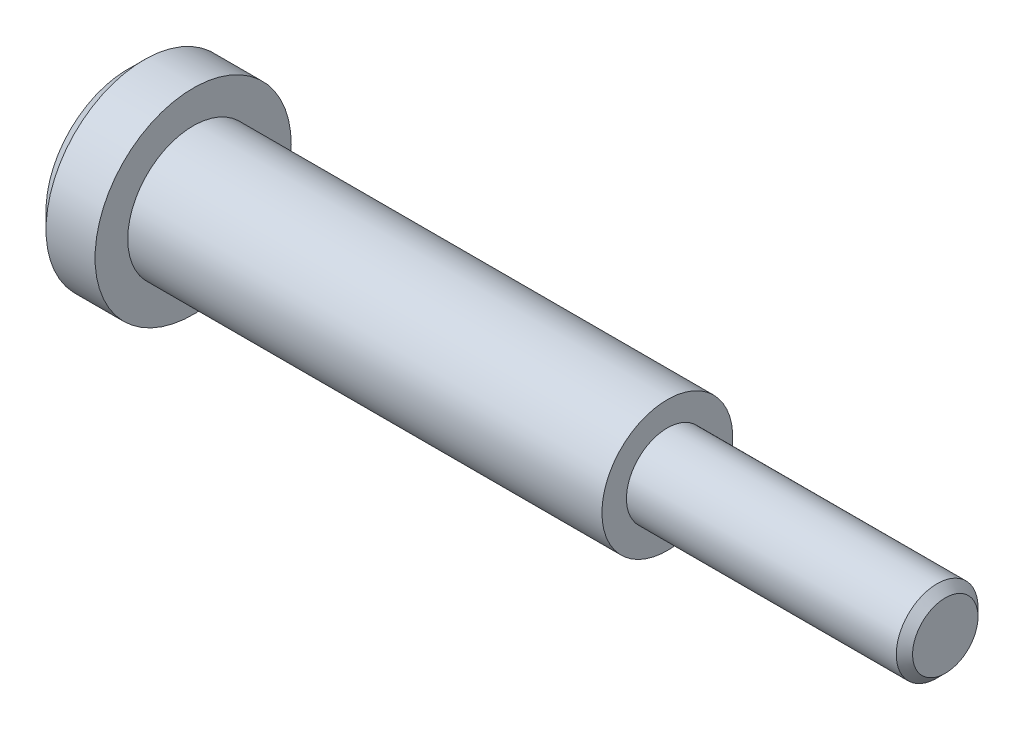
ISO-10303-21;
HEADER;
FILE_DESCRIPTION(('STEP AP214'),'2;1');
FILE_NAME('part.step','',(''),(''),'','','');
FILE_SCHEMA(('AUTOMOTIVE_DESIGN { 1 0 10303 214 1 1 1 1 }'));
ENDSEC;
DATA;
#1=APPLICATION_CONTEXT('core data for automotive mechanical design processes');
#2=APPLICATION_PROTOCOL_DEFINITION('international standard','automotive_design',2000,#1);
#3=PRODUCT_CONTEXT('',#1,'mechanical');
#4=PRODUCT('Part','Part','',(#3));
#5=PRODUCT_RELATED_PRODUCT_CATEGORY('part','',(#4));
#6=PRODUCT_DEFINITION_FORMATION('','',#4);
#7=PRODUCT_DEFINITION_CONTEXT('part definition',#1,'design');
#8=PRODUCT_DEFINITION('design','',#6,#7);
#9=PRODUCT_DEFINITION_SHAPE('','',#8);
#10=(LENGTH_UNIT() NAMED_UNIT(*) SI_UNIT(.MILLI.,.METRE.));
#11=(NAMED_UNIT(*) PLANE_ANGLE_UNIT() SI_UNIT($,.RADIAN.));
#12=(NAMED_UNIT(*) SI_UNIT($,.STERADIAN.) SOLID_ANGLE_UNIT());
#13=UNCERTAINTY_MEASURE_WITH_UNIT(LENGTH_MEASURE(1.E-05),#10,'distance_accuracy_value','');
#14=(GEOMETRIC_REPRESENTATION_CONTEXT(3) GLOBAL_UNCERTAINTY_ASSIGNED_CONTEXT((#13)) GLOBAL_UNIT_ASSIGNED_CONTEXT((#10,
#11,#12)) REPRESENTATION_CONTEXT('',''));
#15=CARTESIAN_POINT('',(0.,0.,0.));
#16=DIRECTION('',(0.,0.,1.));
#17=DIRECTION('',(1.,0.,0.));
#18=AXIS2_PLACEMENT_3D('',#15,#16,#17);
#19=CARTESIAN_POINT('',(4.,0.,0.));
#20=DIRECTION('',(-1.,0.,0.));
#21=DIRECTION('',(0.,0.,1.));
#22=AXIS2_PLACEMENT_3D('',#19,#20,#21);
#23=CYLINDRICAL_SURFACE('',#22,6.);
#24=CARTESIAN_POINT('',(1.00000000000002,0.,0.));
#25=DIRECTION('',(1.,0.,0.));
#26=DIRECTION('',(0.,0.,-1.));
#27=AXIS2_PLACEMENT_3D('',#24,#25,#26);
#28=CIRCLE('',#27,6.);
#29=CARTESIAN_POINT('',(1.00000000000002,0.,-6.));
#30=VERTEX_POINT('',#29);
#31=EDGE_CURVE('E45',#30,#30,#28,.T.);
#32=ORIENTED_EDGE('',*,*,#31,.T.);
#33=EDGE_LOOP('',(#32));
#34=FACE_BOUND('',#33,.T.);
#35=CARTESIAN_POINT('',(4.,0.,0.));
#36=DIRECTION('',(1.,0.,0.));
#37=DIRECTION('',(0.,0.,-1.));
#38=AXIS2_PLACEMENT_3D('',#35,#36,#37);
#39=CIRCLE('',#38,6.);
#40=CARTESIAN_POINT('',(4.,0.,-6.));
#41=VERTEX_POINT('',#40);
#42=EDGE_CURVE('E57',#41,#41,#39,.T.);
#43=ORIENTED_EDGE('',*,*,#42,.F.);
#44=EDGE_LOOP('',(#43));
#45=FACE_BOUND('',#44,.T.);
#46=ADVANCED_FACE('F30',(#34,#45),#23,.T.);
#47=CARTESIAN_POINT('',(4.,0.,0.));
#48=DIRECTION('',(1.,0.,0.));
#49=DIRECTION('',(0.,0.,-1.));
#50=AXIS2_PLACEMENT_3D('',#47,#48,#49);
#51=PLANE('',#50);
#52=CARTESIAN_POINT('',(4.,0.,0.));
#53=DIRECTION('',(1.,0.,0.));
#54=DIRECTION('',(0.,0.,-1.));
#55=AXIS2_PLACEMENT_3D('',#52,#53,#54);
#56=CIRCLE('',#55,4.);
#57=CARTESIAN_POINT('',(4.,0.,4.));
#58=VERTEX_POINT('',#57);
#59=EDGE_CURVE('E60',#58,#58,#56,.T.);
#60=ORIENTED_EDGE('',*,*,#59,.F.);
#61=EDGE_LOOP('',(#60));
#62=FACE_BOUND('',#61,.T.);
#63=ORIENTED_EDGE('',*,*,#42,.T.);
#64=EDGE_LOOP('',(#63));
#65=FACE_BOUND('',#64,.T.);
#66=ADVANCED_FACE('F87',(#62,#65),#51,.T.);
#67=CARTESIAN_POINT('',(0.,0.,0.));
#68=DIRECTION('',(1.,0.,0.));
#69=DIRECTION('',(0.,0.,-1.));
#70=AXIS2_PLACEMENT_3D('',#67,#68,#69);
#71=PLANE('',#70);
#72=CARTESIAN_POINT('',(0.,0.,0.));
#73=DIRECTION('',(1.,0.,0.));
#74=DIRECTION('',(0.,0.,-1.));
#75=AXIS2_PLACEMENT_3D('',#72,#73,#74);
#76=CIRCLE('',#75,3.);
#77=CARTESIAN_POINT('',(0.,0.,-3.));
#78=VERTEX_POINT('',#77);
#79=EDGE_CURVE('E10',#78,#78,#76,.T.);
#80=ORIENTED_EDGE('',*,*,#79,.T.);
#81=EDGE_LOOP('',(#80));
#82=FACE_BOUND('',#81,.T.);
#83=CARTESIAN_POINT('',(0.,0.,0.));
#84=DIRECTION('',(1.,0.,0.));
#85=DIRECTION('',(0.,0.,-1.));
#86=AXIS2_PLACEMENT_3D('',#83,#84,#85);
#87=CIRCLE('',#86,4.99999999999998);
#88=CARTESIAN_POINT('',(0.,0.,-4.99999999999998));
#89=VERTEX_POINT('',#88);
#90=EDGE_CURVE('E41',#89,#89,#87,.F.);
#91=ORIENTED_EDGE('',*,*,#90,.T.);
#92=EDGE_LOOP('',(#91));
#93=FACE_BOUND('',#92,.T.);
#94=ADVANCED_FACE('F93',(#82,#93),#71,.F.);
#95=CARTESIAN_POINT('',(33.,0.,0.));
#96=DIRECTION('',(-1.,0.,0.));
#97=DIRECTION('',(0.,0.,1.));
#98=AXIS2_PLACEMENT_3D('',#95,#96,#97);
#99=CYLINDRICAL_SURFACE('',#98,4.);
#100=CARTESIAN_POINT('',(33.,0.,0.));
#101=DIRECTION('',(1.,0.,0.));
#102=DIRECTION('',(0.,0.,-1.));
#103=AXIS2_PLACEMENT_3D('',#100,#101,#102);
#104=CIRCLE('',#103,4.);
#105=CARTESIAN_POINT('',(33.,0.,4.));
#106=VERTEX_POINT('',#105);
#107=EDGE_CURVE('E61',#106,#106,#104,.T.);
#108=CARTESIAN_POINT('',(33.,0.,4.));
#109=CARTESIAN_POINT('',(32.6979166666667,0.,4.));
#110=CARTESIAN_POINT('',(32.3958333333333,0.,4.));
#111=CARTESIAN_POINT('',(31.7916666666667,0.,4.));
#112=CARTESIAN_POINT('',(31.4895833333333,0.,4.));
#113=CARTESIAN_POINT('',(30.8854166666667,0.,4.));
#114=CARTESIAN_POINT('',(30.5833333333333,0.,4.));
#115=CARTESIAN_POINT('',(29.9791666666667,0.,4.));
#116=CARTESIAN_POINT('',(29.6770833333333,0.,4.));
#117=CARTESIAN_POINT('',(29.0729166666667,0.,4.));
#118=CARTESIAN_POINT('',(28.7708333333333,0.,4.));
#119=CARTESIAN_POINT('',(28.1666666666667,0.,4.));
#120=CARTESIAN_POINT('',(27.8645833333333,0.,4.));
#121=CARTESIAN_POINT('',(27.2604166666667,0.,4.));
#122=CARTESIAN_POINT('',(26.9583333333333,0.,4.));
#123=CARTESIAN_POINT('',(26.3541666666667,0.,4.));
#124=CARTESIAN_POINT('',(26.0520833333333,0.,4.));
#125=CARTESIAN_POINT('',(25.4479166666667,0.,4.));
#126=CARTESIAN_POINT('',(25.1458333333333,0.,4.));
#127=CARTESIAN_POINT('',(24.5416666666667,0.,4.));
#128=CARTESIAN_POINT('',(24.2395833333333,0.,4.));
#129=CARTESIAN_POINT('',(23.6354166666667,0.,4.));
#130=CARTESIAN_POINT('',(23.3333333333333,0.,4.));
#131=CARTESIAN_POINT('',(22.7291666666667,0.,4.));
#132=CARTESIAN_POINT('',(22.4270833333333,0.,4.));
#133=CARTESIAN_POINT('',(21.8229166666667,0.,4.));
#134=CARTESIAN_POINT('',(21.5208333333333,0.,4.));
#135=CARTESIAN_POINT('',(20.9166666666667,0.,4.));
#136=CARTESIAN_POINT('',(20.6145833333333,0.,4.));
#137=CARTESIAN_POINT('',(20.0104166666667,0.,4.));
#138=CARTESIAN_POINT('',(19.7083333333333,0.,4.));
#139=CARTESIAN_POINT('',(19.1041666666667,0.,4.));
#140=CARTESIAN_POINT('',(18.8020833333333,0.,4.));
#141=CARTESIAN_POINT('',(18.1979166666667,0.,4.));
#142=CARTESIAN_POINT('',(17.8958333333333,0.,4.));
#143=CARTESIAN_POINT('',(17.2916666666667,0.,4.));
#144=CARTESIAN_POINT('',(16.9895833333333,0.,4.));
#145=CARTESIAN_POINT('',(16.3854166666667,0.,4.));
#146=CARTESIAN_POINT('',(16.0833333333333,0.,4.));
#147=CARTESIAN_POINT('',(15.4791666666667,0.,4.));
#148=CARTESIAN_POINT('',(15.1770833333333,0.,4.));
#149=CARTESIAN_POINT('',(14.5729166666667,0.,4.));
#150=CARTESIAN_POINT('',(14.2708333333333,0.,4.));
#151=CARTESIAN_POINT('',(13.6666666666667,0.,4.));
#152=CARTESIAN_POINT('',(13.3645833333333,0.,4.));
#153=CARTESIAN_POINT('',(12.7604166666667,0.,4.));
#154=CARTESIAN_POINT('',(12.4583333333333,0.,4.));
#155=CARTESIAN_POINT('',(11.8541666666667,0.,4.));
#156=CARTESIAN_POINT('',(11.5520833333333,0.,4.));
#157=CARTESIAN_POINT('',(10.9479166666667,0.,4.));
#158=CARTESIAN_POINT('',(10.6458333333333,0.,4.));
#159=CARTESIAN_POINT('',(10.0416666666667,0.,4.));
#160=CARTESIAN_POINT('',(9.73958333333333,0.,4.));
#161=CARTESIAN_POINT('',(9.13541666666667,0.,4.));
#162=CARTESIAN_POINT('',(8.83333333333333,0.,4.));
#163=CARTESIAN_POINT('',(8.22916666666667,0.,4.));
#164=CARTESIAN_POINT('',(7.92708333333333,0.,4.));
#165=CARTESIAN_POINT('',(7.32291666666667,0.,4.));
#166=CARTESIAN_POINT('',(7.02083333333333,0.,4.));
#167=CARTESIAN_POINT('',(6.41666666666667,0.,4.));
#168=CARTESIAN_POINT('',(6.11458333333333,0.,4.));
#169=CARTESIAN_POINT('',(5.51041666666667,0.,4.));
#170=CARTESIAN_POINT('',(5.20833333333333,0.,4.));
#171=CARTESIAN_POINT('',(4.60416666666667,0.,4.));
#172=CARTESIAN_POINT('',(4.30208333333333,0.,4.));
#173=CARTESIAN_POINT('',(4.,0.,4.));
#174=B_SPLINE_CURVE_WITH_KNOTS('',3,(#108,#109,#110,#111,#112,#113,#114,#115,#116,#117,#118,
#119,#120,#121,#122,#123,#124,#125,#126,#127,#128,#129,#130,#131,#132,#133,#134,#135,#136,#137,
#138,#139,#140,#141,#142,#143,#144,#145,#146,#147,#148,#149,#150,#151,#152,#153,#154,#155,#156,
#157,#158,#159,#160,#161,#162,#163,#164,#165,#166,#167,#168,#169,#170,#171,#172,#173),
.UNSPECIFIED.,.F.,.F.,(4,2,2,2,2,2,2,2,2,2,2,2,2,2,2,2,2,2,2,2,2,2,2,2,2,2,2,2,2,2,2,2,4),(0.,
0.906249999999997,1.81249999999999,2.71875,3.625,4.53125,5.4375,6.34375,7.25,8.15625,
9.06249999999999,9.96874999999999,10.875,11.78125,12.6875,13.59375,14.5,15.40625,16.3125,
17.21875,18.125,19.03125,19.9375,20.84375,21.75,22.65625,23.5625,24.46875,25.375,26.28125,
27.1875,28.09375,29.),.UNSPECIFIED.);
#175=EDGE_CURVE('BSEAM119',#106,#58,#174,.T.);
#176=ORIENTED_EDGE('',*,*,#107,.F.);
#177=ORIENTED_EDGE('',*,*,#59,.T.);
#178=ORIENTED_EDGE('',*,*,#175,.T.);
#179=ORIENTED_EDGE('',*,*,#175,.F.);
#180=EDGE_LOOP('',(#176,#178,#177,#179));
#181=FACE_BOUND('',#180,.T.);
#182=ADVANCED_FACE('F119',(#181),#99,.T.);
#183=CARTESIAN_POINT('',(33.,0.,0.));
#184=DIRECTION('',(1.,0.,0.));
#185=DIRECTION('',(0.,0.,-1.));
#186=AXIS2_PLACEMENT_3D('',#183,#184,#185);
#187=PLANE('',#186);
#188=CARTESIAN_POINT('',(33.,0.,0.));
#189=DIRECTION('',(1.,0.,0.));
#190=DIRECTION('',(0.,0.,-1.));
#191=AXIS2_PLACEMENT_3D('',#188,#189,#190);
#192=CIRCLE('',#191,2.5);
#193=CARTESIAN_POINT('',(33.,0.,-2.5));
#194=VERTEX_POINT('',#193);
#195=EDGE_CURVE('E56',#194,#194,#192,.T.);
#196=ORIENTED_EDGE('',*,*,#195,.F.);
#197=EDGE_LOOP('',(#196));
#198=FACE_BOUND('',#197,.T.);
#199=ORIENTED_EDGE('',*,*,#107,.T.);
#200=EDGE_LOOP('',(#199));
#201=FACE_BOUND('',#200,.T.);
#202=ADVANCED_FACE('F113',(#198,#201),#187,.T.);
#203=CARTESIAN_POINT('',(50.,0.,0.));
#204=DIRECTION('',(-1.,0.,0.));
#205=DIRECTION('',(0.,0.,1.));
#206=AXIS2_PLACEMENT_3D('',#203,#204,#205);
#207=CYLINDRICAL_SURFACE('',#206,2.5);
#208=CARTESIAN_POINT('',(49.5,0.,0.));
#209=DIRECTION('',(1.,0.,0.));
#210=DIRECTION('',(0.,0.,-1.));
#211=AXIS2_PLACEMENT_3D('',#208,#209,#210);
#212=CIRCLE('',#211,2.5);
#213=CARTESIAN_POINT('',(49.5,0.,-2.5));
#214=VERTEX_POINT('',#213);
#215=EDGE_CURVE('E50',#214,#214,#212,.F.);
#216=ORIENTED_EDGE('',*,*,#215,.T.);
#217=EDGE_LOOP('',(#216));
#218=FACE_BOUND('',#217,.T.);
#219=ORIENTED_EDGE('',*,*,#195,.T.);
#220=EDGE_LOOP('',(#219));
#221=FACE_BOUND('',#220,.T.);
#222=ADVANCED_FACE('F105',(#218,#221),#207,.T.);
#223=CARTESIAN_POINT('',(50.,0.,0.));
#224=DIRECTION('',(1.,0.,0.));
#225=DIRECTION('',(0.,0.,-1.));
#226=AXIS2_PLACEMENT_3D('',#223,#224,#225);
#227=PLANE('',#226);
#228=CARTESIAN_POINT('',(50.,0.,0.));
#229=DIRECTION('',(1.,0.,0.));
#230=DIRECTION('',(0.,0.,-1.));
#231=AXIS2_PLACEMENT_3D('',#228,#229,#230);
#232=CIRCLE('',#231,1.99999999999999);
#233=CARTESIAN_POINT('',(50.,0.,-1.99999999999999));
#234=VERTEX_POINT('',#233);
#235=EDGE_CURVE('E53',#234,#234,#232,.T.);
#236=ORIENTED_EDGE('',*,*,#235,.T.);
#237=EDGE_LOOP('',(#236));
#238=FACE_BOUND('',#237,.T.);
#239=ADVANCED_FACE('F100',(#238),#227,.T.);
#240=CARTESIAN_POINT('',(50.,0.,0.));
#241=DIRECTION('',(-1.,0.,0.));
#242=DIRECTION('',(0.,0.,1.));
#243=AXIS2_PLACEMENT_3D('',#240,#241,#242);
#244=CONICAL_SURFACE('',#243,1.99999999999999,0.785398163397446);
#245=ORIENTED_EDGE('',*,*,#215,.F.);
#246=EDGE_LOOP('',(#245));
#247=FACE_BOUND('',#246,.T.);
#248=ORIENTED_EDGE('',*,*,#235,.F.);
#249=EDGE_LOOP('',(#248));
#250=FACE_BOUND('',#249,.T.);
#251=ADVANCED_FACE('F83',(#247,#250),#244,.T.);
#252=CARTESIAN_POINT('',(1.00000000000002,0.,0.));
#253=DIRECTION('',(1.,0.,0.));
#254=DIRECTION('',(0.,0.,-1.));
#255=AXIS2_PLACEMENT_3D('',#252,#253,#254);
#256=CONICAL_SURFACE('',#255,6.,0.785398163397452);
#257=ORIENTED_EDGE('',*,*,#90,.F.);
#258=EDGE_LOOP('',(#257));
#259=FACE_BOUND('',#258,.T.);
#260=ORIENTED_EDGE('',*,*,#31,.F.);
#261=EDGE_LOOP('',(#260));
#262=FACE_BOUND('',#261,.T.);
#263=ADVANCED_FACE('F76',(#259,#262),#256,.T.);
#264=CARTESIAN_POINT('',(1.,0.,0.));
#265=DIRECTION('',(-1.,0.,0.));
#266=DIRECTION('',(0.,0.,1.));
#267=AXIS2_PLACEMENT_3D('',#264,#265,#266);
#268=CYLINDRICAL_SURFACE('',#267,2.5);
#269=CARTESIAN_POINT('',(0.5,0.,0.));
#270=DIRECTION('',(1.,0.,0.));
#271=DIRECTION('',(0.,0.,-1.));
#272=AXIS2_PLACEMENT_3D('',#269,#270,#271);
#273=CIRCLE('',#272,2.5);
#274=CARTESIAN_POINT('',(0.5,0.,-2.5));
#275=VERTEX_POINT('',#274);
#276=EDGE_CURVE('E37',#275,#275,#273,.F.);
#277=ORIENTED_EDGE('',*,*,#276,.T.);
#278=EDGE_LOOP('',(#277));
#279=FACE_BOUND('',#278,.T.);
#280=CARTESIAN_POINT('',(1.,0.,0.));
#281=DIRECTION('',(-1.,0.,0.));
#282=DIRECTION('',(0.,0.,1.));
#283=AXIS2_PLACEMENT_3D('',#280,#281,#282);
#284=CIRCLE('',#283,2.5);
#285=CARTESIAN_POINT('',(1.,0.,2.5));
#286=VERTEX_POINT('',#285);
#287=EDGE_CURVE('E66',#286,#286,#284,.T.);
#288=ORIENTED_EDGE('',*,*,#287,.F.);
#289=EDGE_LOOP('',(#288));
#290=FACE_BOUND('',#289,.T.);
#291=ADVANCED_FACE('F74',(#279,#290),#268,.F.);
#292=CARTESIAN_POINT('',(1.,0.,0.));
#293=DIRECTION('',(-1.,0.,0.));
#294=DIRECTION('',(0.,0.,1.));
#295=AXIS2_PLACEMENT_3D('',#292,#293,#294);
#296=PLANE('',#295);
#297=ORIENTED_EDGE('',*,*,#287,.T.);
#298=EDGE_LOOP('',(#297));
#299=FACE_BOUND('',#298,.T.);
#300=ADVANCED_FACE('F72',(#299),#296,.T.);
#301=CARTESIAN_POINT('',(0.5,0.,0.));
#302=DIRECTION('',(1.,0.,0.));
#303=DIRECTION('',(0.,0.,-1.));
#304=AXIS2_PLACEMENT_3D('',#301,#302,#303);
#305=TOROIDAL_SURFACE('',#304,3.,0.5);
#306=ORIENTED_EDGE('',*,*,#79,.F.);
#307=EDGE_LOOP('',(#306));
#308=FACE_BOUND('',#307,.T.);
#309=ORIENTED_EDGE('',*,*,#276,.F.);
#310=EDGE_LOOP('',(#309));
#311=FACE_BOUND('',#310,.T.);
#312=ADVANCED_FACE('F32',(#308,#311),#305,.T.);
#313=CLOSED_SHELL('',(#46,#66,#94,#182,#202,#222,#239,#251,#263,#291,#300,#312));
#314=MANIFOLD_SOLID_BREP('B2',#313);
#315=ADVANCED_BREP_SHAPE_REPRESENTATION('',(#18,#314),#14);
#316=SHAPE_DEFINITION_REPRESENTATION(#9,#315);
ENDSEC;
END-ISO-10303-21;
